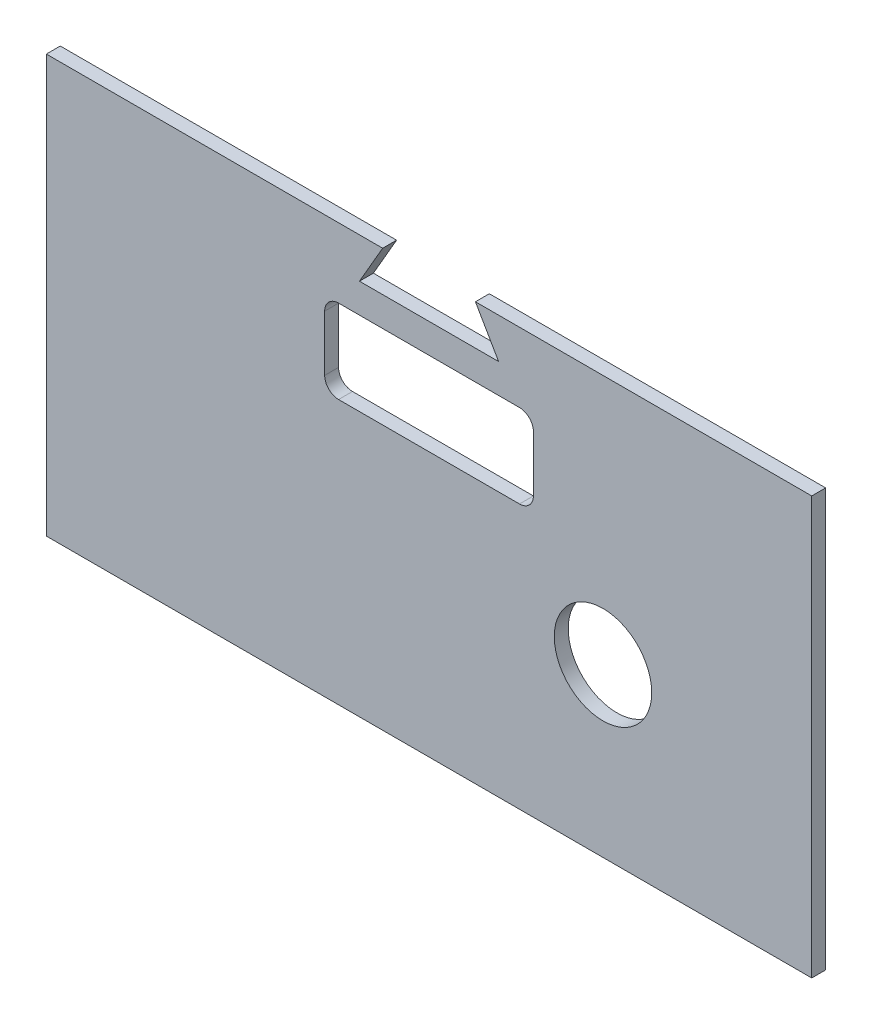
ISO-10303-21;
HEADER;
FILE_DESCRIPTION(('STEP AP214'),'2;1');
FILE_NAME('part.step','',(''),(''),'','','');
FILE_SCHEMA(('AUTOMOTIVE_DESIGN { 1 0 10303 214 1 1 1 1 }'));
ENDSEC;
DATA;
#1=APPLICATION_CONTEXT('core data for automotive mechanical design processes');
#2=APPLICATION_PROTOCOL_DEFINITION('international standard','automotive_design',2000,#1);
#3=PRODUCT_CONTEXT('',#1,'mechanical');
#4=PRODUCT('Part','Part','',(#3));
#5=PRODUCT_RELATED_PRODUCT_CATEGORY('part','',(#4));
#6=PRODUCT_DEFINITION_FORMATION('','',#4);
#7=PRODUCT_DEFINITION_CONTEXT('part definition',#1,'design');
#8=PRODUCT_DEFINITION('design','',#6,#7);
#9=PRODUCT_DEFINITION_SHAPE('','',#8);
#10=(LENGTH_UNIT() NAMED_UNIT(*) SI_UNIT(.MILLI.,.METRE.));
#11=(NAMED_UNIT(*) PLANE_ANGLE_UNIT() SI_UNIT($,.RADIAN.));
#12=(NAMED_UNIT(*) SI_UNIT($,.STERADIAN.) SOLID_ANGLE_UNIT());
#13=UNCERTAINTY_MEASURE_WITH_UNIT(LENGTH_MEASURE(1.E-05),#10,'distance_accuracy_value','');
#14=(GEOMETRIC_REPRESENTATION_CONTEXT(3) GLOBAL_UNCERTAINTY_ASSIGNED_CONTEXT((#13)) GLOBAL_UNIT_ASSIGNED_CONTEXT((#10,
#11,#12)) REPRESENTATION_CONTEXT('',''));
#15=CARTESIAN_POINT('',(0.,0.,0.));
#16=DIRECTION('',(0.,0.,1.));
#17=DIRECTION('',(1.,0.,0.));
#18=AXIS2_PLACEMENT_3D('',#15,#16,#17);
#19=CARTESIAN_POINT('',(-27.5,15.,1.));
#20=DIRECTION('',(0.,-1.,0.));
#21=DIRECTION('',(0.,0.,-1.));
#22=AXIS2_PLACEMENT_3D('',#19,#20,#21);
#23=PLANE('',#22);
#24=DIRECTION('',(-1.,0.,0.));
#25=VECTOR('',#24,1.);
#26=CARTESIAN_POINT('',(-27.5,15.,0.));
#27=LINE('',#26,#25);
#28=CARTESIAN_POINT('',(27.5,15.,0.));
#29=VERTEX_POINT('',#28);
#30=CARTESIAN_POINT('',(3.33333333333333,15.,0.));
#31=VERTEX_POINT('',#30);
#32=EDGE_CURVE('E228',#29,#31,#27,.T.);
#33=ORIENTED_EDGE('',*,*,#32,.T.);
#34=DIRECTION('',(0.,0.,1.));
#35=VECTOR('',#34,1.);
#36=CARTESIAN_POINT('',(3.33333333333333,15.,1.));
#37=LINE('',#36,#35);
#38=CARTESIAN_POINT('',(3.33333333333333,15.,1.));
#39=VERTEX_POINT('',#38);
#40=EDGE_CURVE('E163',#31,#39,#37,.T.);
#41=ORIENTED_EDGE('',*,*,#40,.T.);
#42=DIRECTION('',(-1.,0.,0.));
#43=VECTOR('',#42,1.);
#44=CARTESIAN_POINT('',(-27.5,15.,1.));
#45=LINE('',#44,#43);
#46=CARTESIAN_POINT('',(27.5,15.,1.));
#47=VERTEX_POINT('',#46);
#48=EDGE_CURVE('E217',#47,#39,#45,.T.);
#49=ORIENTED_EDGE('',*,*,#48,.F.);
#50=DIRECTION('',(0.,0.,-1.));
#51=VECTOR('',#50,1.);
#52=CARTESIAN_POINT('',(27.5,15.,1.));
#53=LINE('',#52,#51);
#54=EDGE_CURVE('E241',#47,#29,#53,.T.);
#55=ORIENTED_EDGE('',*,*,#54,.T.);
#56=EDGE_LOOP('',(#33,#41,#49,#55));
#57=FACE_BOUND('',#56,.T.);
#58=ADVANCED_FACE('F33',(#57),#23,.F.);
#59=CARTESIAN_POINT('',(27.5,-15.,1.));
#60=DIRECTION('',(-1.,0.,0.));
#61=DIRECTION('',(0.,0.,1.));
#62=AXIS2_PLACEMENT_3D('',#59,#60,#61);
#63=PLANE('',#62);
#64=DIRECTION('',(0.,1.,0.));
#65=VECTOR('',#64,1.);
#66=CARTESIAN_POINT('',(27.5,-15.,0.));
#67=LINE('',#66,#65);
#68=CARTESIAN_POINT('',(27.5,-15.,0.));
#69=VERTEX_POINT('',#68);
#70=EDGE_CURVE('E211',#69,#29,#67,.T.);
#71=ORIENTED_EDGE('',*,*,#70,.T.);
#72=ORIENTED_EDGE('',*,*,#54,.F.);
#73=DIRECTION('',(0.,1.,0.));
#74=VECTOR('',#73,1.);
#75=CARTESIAN_POINT('',(27.5,-15.,1.));
#76=LINE('',#75,#74);
#77=CARTESIAN_POINT('',(27.5,-15.,1.));
#78=VERTEX_POINT('',#77);
#79=EDGE_CURVE('E212',#78,#47,#76,.T.);
#80=ORIENTED_EDGE('',*,*,#79,.F.);
#81=DIRECTION('',(0.,0.,-1.));
#82=VECTOR('',#81,1.);
#83=CARTESIAN_POINT('',(27.5,-15.,1.));
#84=LINE('',#83,#82);
#85=EDGE_CURVE('E224',#78,#69,#84,.T.);
#86=ORIENTED_EDGE('',*,*,#85,.T.);
#87=EDGE_LOOP('',(#71,#72,#80,#86));
#88=FACE_BOUND('',#87,.T.);
#89=ADVANCED_FACE('F294',(#88),#63,.F.);
#90=CARTESIAN_POINT('',(-3.33333333333334,15.,1.));
#91=VERTEX_POINT('',#90);
#92=CARTESIAN_POINT('',(-27.5,15.,1.));
#93=VERTEX_POINT('',#92);
#94=EDGE_CURVE('E215',#91,#93,#45,.T.);
#95=ORIENTED_EDGE('',*,*,#94,.F.);
#96=DIRECTION('',(0.,0.,-1.));
#97=VECTOR('',#96,1.);
#98=CARTESIAN_POINT('',(-3.33333333333334,15.,1.));
#99=LINE('',#98,#97);
#100=CARTESIAN_POINT('',(-3.33333333333334,15.,0.));
#101=VERTEX_POINT('',#100);
#102=EDGE_CURVE('E204',#91,#101,#99,.T.);
#103=ORIENTED_EDGE('',*,*,#102,.T.);
#104=CARTESIAN_POINT('',(-27.5,15.,0.));
#105=VERTEX_POINT('',#104);
#106=EDGE_CURVE('E227',#101,#105,#27,.T.);
#107=ORIENTED_EDGE('',*,*,#106,.T.);
#108=DIRECTION('',(0.,0.,-1.));
#109=VECTOR('',#108,1.);
#110=CARTESIAN_POINT('',(-27.5,15.,1.));
#111=LINE('',#110,#109);
#112=EDGE_CURVE('E238',#93,#105,#111,.T.);
#113=ORIENTED_EDGE('',*,*,#112,.F.);
#114=EDGE_LOOP('',(#95,#103,#107,#113));
#115=FACE_BOUND('',#114,.T.);
#116=ADVANCED_FACE('F297',(#115),#23,.F.);
#117=CARTESIAN_POINT('',(-27.5,-15.,1.));
#118=DIRECTION('',(1.,0.,0.));
#119=DIRECTION('',(0.,0.,-1.));
#120=AXIS2_PLACEMENT_3D('',#117,#118,#119);
#121=PLANE('',#120);
#122=DIRECTION('',(0.,-1.,0.));
#123=VECTOR('',#122,1.);
#124=CARTESIAN_POINT('',(-27.5,-15.,0.));
#125=LINE('',#124,#123);
#126=CARTESIAN_POINT('',(-27.5,-15.,0.));
#127=VERTEX_POINT('',#126);
#128=EDGE_CURVE('E230',#105,#127,#125,.T.);
#129=ORIENTED_EDGE('',*,*,#128,.T.);
#130=DIRECTION('',(0.,0.,-1.));
#131=VECTOR('',#130,1.);
#132=CARTESIAN_POINT('',(-27.5,-15.,1.));
#133=LINE('',#132,#131);
#134=CARTESIAN_POINT('',(-27.5,-15.,1.));
#135=VERTEX_POINT('',#134);
#136=EDGE_CURVE('E235',#135,#127,#133,.T.);
#137=ORIENTED_EDGE('',*,*,#136,.F.);
#138=DIRECTION('',(0.,-1.,0.));
#139=VECTOR('',#138,1.);
#140=CARTESIAN_POINT('',(-27.5,-15.,1.));
#141=LINE('',#140,#139);
#142=EDGE_CURVE('E220',#93,#135,#141,.T.);
#143=ORIENTED_EDGE('',*,*,#142,.F.);
#144=ORIENTED_EDGE('',*,*,#112,.T.);
#145=EDGE_LOOP('',(#129,#137,#143,#144));
#146=FACE_BOUND('',#145,.T.);
#147=ADVANCED_FACE('F305',(#146),#121,.F.);
#148=CARTESIAN_POINT('',(-27.5,-15.,1.));
#149=DIRECTION('',(0.,1.,0.));
#150=DIRECTION('',(0.,0.,1.));
#151=AXIS2_PLACEMENT_3D('',#148,#149,#150);
#152=PLANE('',#151);
#153=DIRECTION('',(1.,0.,0.));
#154=VECTOR('',#153,1.);
#155=CARTESIAN_POINT('',(-27.5,-15.,0.));
#156=LINE('',#155,#154);
#157=EDGE_CURVE('E216',#127,#69,#156,.T.);
#158=ORIENTED_EDGE('',*,*,#157,.T.);
#159=ORIENTED_EDGE('',*,*,#85,.F.);
#160=DIRECTION('',(1.,0.,0.));
#161=VECTOR('',#160,1.);
#162=CARTESIAN_POINT('',(-27.5,-15.,1.));
#163=LINE('',#162,#161);
#164=EDGE_CURVE('E222',#135,#78,#163,.T.);
#165=ORIENTED_EDGE('',*,*,#164,.F.);
#166=ORIENTED_EDGE('',*,*,#136,.T.);
#167=EDGE_LOOP('',(#158,#159,#165,#166));
#168=FACE_BOUND('',#167,.T.);
#169=ADVANCED_FACE('F310',(#168),#152,.F.);
#170=CARTESIAN_POINT('',(0.,0.,1.));
#171=DIRECTION('',(0.,0.,-1.));
#172=DIRECTION('',(-1.,0.,0.));
#173=AXIS2_PLACEMENT_3D('',#170,#171,#172);
#174=PLANE('',#173);
#175=CARTESIAN_POINT('',(12.5,-3.,1.));
#176=DIRECTION('',(0.,0.,-1.));
#177=DIRECTION('',(-1.,0.,0.));
#178=AXIS2_PLACEMENT_3D('',#175,#176,#177);
#179=CIRCLE('',#178,3.5);
#180=CARTESIAN_POINT('',(8.99999999999999,-3.,1.));
#181=VERTEX_POINT('',#180);
#182=EDGE_CURVE('E198',#181,#181,#179,.T.);
#183=ORIENTED_EDGE('',*,*,#182,.T.);
#184=EDGE_LOOP('',(#183));
#185=FACE_BOUND('',#184,.T.);
#186=DIRECTION('',(0.,-1.,0.));
#187=VECTOR('',#186,1.);
#188=CARTESIAN_POINT('',(7.49999999999999,0.,1.));
#189=LINE('',#188,#187);
#190=CARTESIAN_POINT('',(7.49999999999999,9.00000000000001,1.));
#191=VERTEX_POINT('',#190);
#192=CARTESIAN_POINT('',(7.49999999999999,5.,1.));
#193=VERTEX_POINT('',#192);
#194=EDGE_CURVE('E191',#191,#193,#189,.T.);
#195=ORIENTED_EDGE('',*,*,#194,.T.);
#196=CARTESIAN_POINT('',(6.49999999999999,5.,1.));
#197=DIRECTION('',(0.,0.,-1.));
#198=DIRECTION('',(-1.,0.,0.));
#199=AXIS2_PLACEMENT_3D('',#196,#197,#198);
#200=CIRCLE('',#199,1.);
#201=CARTESIAN_POINT('',(6.49999999999999,4.,1.));
#202=VERTEX_POINT('',#201);
#203=EDGE_CURVE('E268',#193,#202,#200,.T.);
#204=ORIENTED_EDGE('',*,*,#203,.T.);
#205=DIRECTION('',(-1.,0.,0.));
#206=VECTOR('',#205,1.);
#207=CARTESIAN_POINT('',(0.,4.,1.));
#208=LINE('',#207,#206);
#209=CARTESIAN_POINT('',(-6.50000000000001,4.,1.));
#210=VERTEX_POINT('',#209);
#211=EDGE_CURVE('E188',#202,#210,#208,.T.);
#212=ORIENTED_EDGE('',*,*,#211,.T.);
#213=CARTESIAN_POINT('',(-6.50000000000001,5.,1.));
#214=DIRECTION('',(0.,0.,-1.));
#215=DIRECTION('',(-1.,0.,0.));
#216=AXIS2_PLACEMENT_3D('',#213,#214,#215);
#217=CIRCLE('',#216,1.);
#218=CARTESIAN_POINT('',(-7.50000000000001,5.,1.));
#219=VERTEX_POINT('',#218);
#220=EDGE_CURVE('E264',#210,#219,#217,.T.);
#221=ORIENTED_EDGE('',*,*,#220,.T.);
#222=DIRECTION('',(0.,1.,0.));
#223=VECTOR('',#222,1.);
#224=CARTESIAN_POINT('',(-7.50000000000001,0.,1.));
#225=LINE('',#224,#223);
#226=CARTESIAN_POINT('',(-7.50000000000001,9.00000000000001,1.));
#227=VERTEX_POINT('',#226);
#228=EDGE_CURVE('E196',#219,#227,#225,.T.);
#229=ORIENTED_EDGE('',*,*,#228,.T.);
#230=CARTESIAN_POINT('',(-6.50000000000001,9.00000000000001,1.));
#231=DIRECTION('',(0.,0.,-1.));
#232=DIRECTION('',(-1.,0.,0.));
#233=AXIS2_PLACEMENT_3D('',#230,#231,#232);
#234=CIRCLE('',#233,1.);
#235=CARTESIAN_POINT('',(-6.50000000000001,10.,1.));
#236=VERTEX_POINT('',#235);
#237=EDGE_CURVE('E41',#227,#236,#234,.T.);
#238=ORIENTED_EDGE('',*,*,#237,.T.);
#239=DIRECTION('',(1.,0.,0.));
#240=VECTOR('',#239,1.);
#241=CARTESIAN_POINT('',(0.,10.,1.));
#242=LINE('',#241,#240);
#243=CARTESIAN_POINT('',(6.49999999999998,10.,1.));
#244=VERTEX_POINT('',#243);
#245=EDGE_CURVE('E194',#236,#244,#242,.T.);
#246=ORIENTED_EDGE('',*,*,#245,.T.);
#247=CARTESIAN_POINT('',(6.49999999999998,9.00000000000001,1.));
#248=DIRECTION('',(0.,0.,-1.));
#249=DIRECTION('',(-1.,0.,0.));
#250=AXIS2_PLACEMENT_3D('',#247,#248,#249);
#251=CIRCLE('',#250,1.);
#252=EDGE_CURVE('E48',#244,#191,#251,.T.);
#253=ORIENTED_EDGE('',*,*,#252,.T.);
#254=EDGE_LOOP('',(#195,#204,#212,#221,#229,#238,#246,#253));
#255=FACE_BOUND('',#254,.T.);
#256=ORIENTED_EDGE('',*,*,#48,.T.);
#257=DIRECTION('',(0.5,-0.866025403784439,0.));
#258=VECTOR('',#257,1.);
#259=CARTESIAN_POINT('',(8.99519052838328,5.19337567297406,1.));
#260=LINE('',#259,#258);
#261=CARTESIAN_POINT('',(4.99999999999999,12.1132486540519,1.));
#262=VERTEX_POINT('',#261);
#263=EDGE_CURVE('E208',#39,#262,#260,.T.);
#264=ORIENTED_EDGE('',*,*,#263,.T.);
#265=DIRECTION('',(-1.,0.,0.));
#266=VECTOR('',#265,1.);
#267=CARTESIAN_POINT('',(0.,12.1132486540519,1.));
#268=LINE('',#267,#266);
#269=CARTESIAN_POINT('',(-5.,12.1132486540519,1.));
#270=VERTEX_POINT('',#269);
#271=EDGE_CURVE('E153',#262,#270,#268,.T.);
#272=ORIENTED_EDGE('',*,*,#271,.T.);
#273=DIRECTION('',(0.5,0.866025403784439,0.));
#274=VECTOR('',#273,1.);
#275=CARTESIAN_POINT('',(-8.9951905283833,5.19337567297407,1.));
#276=LINE('',#275,#274);
#277=EDGE_CURVE('E201',#270,#91,#276,.T.);
#278=ORIENTED_EDGE('',*,*,#277,.T.);
#279=ORIENTED_EDGE('',*,*,#94,.T.);
#280=ORIENTED_EDGE('',*,*,#142,.T.);
#281=ORIENTED_EDGE('',*,*,#164,.T.);
#282=ORIENTED_EDGE('',*,*,#79,.T.);
#283=EDGE_LOOP('',(#256,#264,#272,#278,#279,#280,#281,#282));
#284=FACE_BOUND('',#283,.T.);
#285=ADVANCED_FACE('F316',(#185,#255,#284),#174,.F.);
#286=CARTESIAN_POINT('',(0.,0.,0.));
#287=DIRECTION('',(0.,0.,-1.));
#288=DIRECTION('',(-1.,0.,0.));
#289=AXIS2_PLACEMENT_3D('',#286,#287,#288);
#290=PLANE('',#289);
#291=DIRECTION('',(-0.5,0.866025403784439,0.));
#292=VECTOR('',#291,1.);
#293=CARTESIAN_POINT('',(4.99999999999999,12.1132486540519,0.));
#294=LINE('',#293,#292);
#295=CARTESIAN_POINT('',(4.99999999999999,12.1132486540519,0.));
#296=VERTEX_POINT('',#295);
#297=EDGE_CURVE('E160',#296,#31,#294,.T.);
#298=ORIENTED_EDGE('',*,*,#297,.T.);
#299=ORIENTED_EDGE('',*,*,#32,.F.);
#300=ORIENTED_EDGE('',*,*,#70,.F.);
#301=ORIENTED_EDGE('',*,*,#157,.F.);
#302=ORIENTED_EDGE('',*,*,#128,.F.);
#303=ORIENTED_EDGE('',*,*,#106,.F.);
#304=DIRECTION('',(0.5,0.866025403784439,0.));
#305=VECTOR('',#304,1.);
#306=CARTESIAN_POINT('',(-8.9951905283833,5.19337567297407,0.));
#307=LINE('',#306,#305);
#308=CARTESIAN_POINT('',(-5.,12.1132486540519,0.));
#309=VERTEX_POINT('',#308);
#310=EDGE_CURVE('E171',#309,#101,#307,.T.);
#311=ORIENTED_EDGE('',*,*,#310,.F.);
#312=DIRECTION('',(1.,0.,0.));
#313=VECTOR('',#312,1.);
#314=CARTESIAN_POINT('',(-5.,12.1132486540519,0.));
#315=LINE('',#314,#313);
#316=EDGE_CURVE('E150',#309,#296,#315,.T.);
#317=ORIENTED_EDGE('',*,*,#316,.T.);
#318=EDGE_LOOP('',(#298,#299,#300,#301,#302,#303,#311,#317));
#319=FACE_BOUND('',#318,.T.);
#320=CARTESIAN_POINT('',(12.5,-3.,0.));
#321=DIRECTION('',(0.,0.,1.));
#322=DIRECTION('',(1.,0.,0.));
#323=AXIS2_PLACEMENT_3D('',#320,#321,#322);
#324=CIRCLE('',#323,3.5);
#325=CARTESIAN_POINT('',(16.,-3.,0.));
#326=VERTEX_POINT('',#325);
#327=EDGE_CURVE('E156',#326,#326,#324,.T.);
#328=ORIENTED_EDGE('',*,*,#327,.T.);
#329=EDGE_LOOP('',(#328));
#330=FACE_BOUND('',#329,.T.);
#331=DIRECTION('',(-1.,0.,0.));
#332=VECTOR('',#331,1.);
#333=CARTESIAN_POINT('',(-7.50000000000001,10.,0.));
#334=LINE('',#333,#332);
#335=CARTESIAN_POINT('',(6.49999999999998,10.,0.));
#336=VERTEX_POINT('',#335);
#337=CARTESIAN_POINT('',(-6.50000000000001,10.,0.));
#338=VERTEX_POINT('',#337);
#339=EDGE_CURVE('E185',#336,#338,#334,.T.);
#340=ORIENTED_EDGE('',*,*,#339,.T.);
#341=CARTESIAN_POINT('',(-6.50000000000001,9.00000000000001,0.));
#342=DIRECTION('',(0.,0.,-1.));
#343=DIRECTION('',(-1.,0.,0.));
#344=AXIS2_PLACEMENT_3D('',#341,#342,#343);
#345=CIRCLE('',#344,1.);
#346=CARTESIAN_POINT('',(-7.50000000000001,9.00000000000001,0.));
#347=VERTEX_POINT('',#346);
#348=EDGE_CURVE('E11',#338,#347,#345,.F.);
#349=ORIENTED_EDGE('',*,*,#348,.T.);
#350=DIRECTION('',(0.,-1.,0.));
#351=VECTOR('',#350,1.);
#352=CARTESIAN_POINT('',(-7.50000000000001,10.,0.));
#353=LINE('',#352,#351);
#354=CARTESIAN_POINT('',(-7.50000000000001,5.,0.));
#355=VERTEX_POINT('',#354);
#356=EDGE_CURVE('E176',#347,#355,#353,.T.);
#357=ORIENTED_EDGE('',*,*,#356,.T.);
#358=CARTESIAN_POINT('',(-6.50000000000001,5.,0.));
#359=DIRECTION('',(0.,0.,-1.));
#360=DIRECTION('',(-1.,0.,0.));
#361=AXIS2_PLACEMENT_3D('',#358,#359,#360);
#362=CIRCLE('',#361,1.);
#363=CARTESIAN_POINT('',(-6.50000000000001,4.,0.));
#364=VERTEX_POINT('',#363);
#365=EDGE_CURVE('E266',#355,#364,#362,.F.);
#366=ORIENTED_EDGE('',*,*,#365,.T.);
#367=DIRECTION('',(1.,0.,0.));
#368=VECTOR('',#367,1.);
#369=CARTESIAN_POINT('',(-7.50000000000001,4.,0.));
#370=LINE('',#369,#368);
#371=CARTESIAN_POINT('',(6.49999999999999,4.,0.));
#372=VERTEX_POINT('',#371);
#373=EDGE_CURVE('E179',#364,#372,#370,.T.);
#374=ORIENTED_EDGE('',*,*,#373,.T.);
#375=CARTESIAN_POINT('',(6.49999999999999,5.,0.));
#376=DIRECTION('',(0.,0.,-1.));
#377=DIRECTION('',(-1.,0.,0.));
#378=AXIS2_PLACEMENT_3D('',#375,#376,#377);
#379=CIRCLE('',#378,1.);
#380=CARTESIAN_POINT('',(7.49999999999999,5.,0.));
#381=VERTEX_POINT('',#380);
#382=EDGE_CURVE('E270',#372,#381,#379,.F.);
#383=ORIENTED_EDGE('',*,*,#382,.T.);
#384=DIRECTION('',(0.,1.,0.));
#385=VECTOR('',#384,1.);
#386=CARTESIAN_POINT('',(7.49999999999999,10.,0.));
#387=LINE('',#386,#385);
#388=CARTESIAN_POINT('',(7.49999999999999,9.00000000000001,0.));
#389=VERTEX_POINT('',#388);
#390=EDGE_CURVE('E182',#381,#389,#387,.T.);
#391=ORIENTED_EDGE('',*,*,#390,.T.);
#392=CARTESIAN_POINT('',(6.49999999999998,9.00000000000001,0.));
#393=DIRECTION('',(0.,0.,-1.));
#394=DIRECTION('',(-1.,0.,0.));
#395=AXIS2_PLACEMENT_3D('',#392,#393,#394);
#396=CIRCLE('',#395,1.);
#397=EDGE_CURVE('E273',#389,#336,#396,.F.);
#398=ORIENTED_EDGE('',*,*,#397,.T.);
#399=EDGE_LOOP('',(#340,#349,#357,#366,#374,#383,#391,#398));
#400=FACE_BOUND('',#399,.T.);
#401=ADVANCED_FACE('F168',(#319,#330,#400),#290,.T.);
#402=CARTESIAN_POINT('',(-7.50000000000001,10.,0.));
#403=DIRECTION('',(-1.,0.,0.));
#404=DIRECTION('',(0.,-1.,0.));
#405=AXIS2_PLACEMENT_3D('',#402,#403,#404);
#406=PLANE('',#405);
#407=ORIENTED_EDGE('',*,*,#228,.F.);
#408=DIRECTION('',(0.,0.,1.));
#409=VECTOR('',#408,1.);
#410=CARTESIAN_POINT('',(-7.50000000000001,5.,0.));
#411=LINE('',#410,#409);
#412=EDGE_CURVE('E253',#219,#355,#411,.F.);
#413=ORIENTED_EDGE('',*,*,#412,.T.);
#414=ORIENTED_EDGE('',*,*,#356,.F.);
#415=DIRECTION('',(0.,0.,1.));
#416=VECTOR('',#415,1.);
#417=CARTESIAN_POINT('',(-7.50000000000001,9.00000000000001,1.));
#418=LINE('',#417,#416);
#419=EDGE_CURVE('E250',#347,#227,#418,.T.);
#420=ORIENTED_EDGE('',*,*,#419,.T.);
#421=EDGE_LOOP('',(#407,#413,#414,#420));
#422=FACE_BOUND('',#421,.T.);
#423=ADVANCED_FACE('F337',(#422),#406,.F.);
#424=CARTESIAN_POINT('',(-7.50000000000001,10.,0.));
#425=DIRECTION('',(0.,1.,0.));
#426=DIRECTION('',(0.,0.,1.));
#427=AXIS2_PLACEMENT_3D('',#424,#425,#426);
#428=PLANE('',#427);
#429=ORIENTED_EDGE('',*,*,#339,.F.);
#430=DIRECTION('',(0.,0.,1.));
#431=VECTOR('',#430,1.);
#432=CARTESIAN_POINT('',(6.49999999999998,10.,1.));
#433=LINE('',#432,#431);
#434=EDGE_CURVE('E262',#336,#244,#433,.T.);
#435=ORIENTED_EDGE('',*,*,#434,.T.);
#436=ORIENTED_EDGE('',*,*,#245,.F.);
#437=DIRECTION('',(0.,0.,1.));
#438=VECTOR('',#437,1.);
#439=CARTESIAN_POINT('',(-6.50000000000001,10.,0.));
#440=LINE('',#439,#438);
#441=EDGE_CURVE('E260',#236,#338,#440,.F.);
#442=ORIENTED_EDGE('',*,*,#441,.T.);
#443=EDGE_LOOP('',(#429,#435,#436,#442));
#444=FACE_BOUND('',#443,.T.);
#445=ADVANCED_FACE('F280',(#444),#428,.F.);
#446=CARTESIAN_POINT('',(7.49999999999999,10.,0.));
#447=DIRECTION('',(1.,0.,0.));
#448=DIRECTION('',(0.,0.,-1.));
#449=AXIS2_PLACEMENT_3D('',#446,#447,#448);
#450=PLANE('',#449);
#451=ORIENTED_EDGE('',*,*,#390,.F.);
#452=DIRECTION('',(0.,0.,1.));
#453=VECTOR('',#452,1.);
#454=CARTESIAN_POINT('',(7.49999999999999,5.,1.));
#455=LINE('',#454,#453);
#456=EDGE_CURVE('E257',#381,#193,#455,.T.);
#457=ORIENTED_EDGE('',*,*,#456,.T.);
#458=ORIENTED_EDGE('',*,*,#194,.F.);
#459=DIRECTION('',(0.,0.,1.));
#460=VECTOR('',#459,1.);
#461=CARTESIAN_POINT('',(7.49999999999999,9.00000000000001,0.));
#462=LINE('',#461,#460);
#463=EDGE_CURVE('E255',#191,#389,#462,.F.);
#464=ORIENTED_EDGE('',*,*,#463,.T.);
#465=EDGE_LOOP('',(#451,#457,#458,#464));
#466=FACE_BOUND('',#465,.T.);
#467=ADVANCED_FACE('F336',(#466),#450,.F.);
#468=CARTESIAN_POINT('',(-7.50000000000001,4.,0.));
#469=DIRECTION('',(0.,-1.,0.));
#470=DIRECTION('',(0.,0.,-1.));
#471=AXIS2_PLACEMENT_3D('',#468,#469,#470);
#472=PLANE('',#471);
#473=ORIENTED_EDGE('',*,*,#373,.F.);
#474=DIRECTION('',(0.,0.,1.));
#475=VECTOR('',#474,1.);
#476=CARTESIAN_POINT('',(-6.50000000000001,4.,1.));
#477=LINE('',#476,#475);
#478=EDGE_CURVE('E247',#364,#210,#477,.T.);
#479=ORIENTED_EDGE('',*,*,#478,.T.);
#480=ORIENTED_EDGE('',*,*,#211,.F.);
#481=DIRECTION('',(0.,0.,1.));
#482=VECTOR('',#481,1.);
#483=CARTESIAN_POINT('',(6.49999999999999,4.,0.));
#484=LINE('',#483,#482);
#485=EDGE_CURVE('E245',#202,#372,#484,.F.);
#486=ORIENTED_EDGE('',*,*,#485,.T.);
#487=EDGE_LOOP('',(#473,#479,#480,#486));
#488=FACE_BOUND('',#487,.T.);
#489=ADVANCED_FACE('F340',(#488),#472,.F.);
#490=CARTESIAN_POINT('',(12.5,-3.,0.));
#491=DIRECTION('',(0.,0.,1.));
#492=DIRECTION('',(1.,0.,0.));
#493=AXIS2_PLACEMENT_3D('',#490,#491,#492);
#494=CYLINDRICAL_SURFACE('',#493,3.5);
#495=ORIENTED_EDGE('',*,*,#327,.F.);
#496=EDGE_LOOP('',(#495));
#497=FACE_BOUND('',#496,.T.);
#498=ORIENTED_EDGE('',*,*,#182,.F.);
#499=EDGE_LOOP('',(#498));
#500=FACE_BOUND('',#499,.T.);
#501=ADVANCED_FACE('F333',(#497,#500),#494,.F.);
#502=CARTESIAN_POINT('',(4.99999999999999,12.1132486540519,0.));
#503=DIRECTION('',(0.866025403784439,0.5,0.));
#504=DIRECTION('',(-0.5,0.866025403784439,0.));
#505=AXIS2_PLACEMENT_3D('',#502,#503,#504);
#506=PLANE('',#505);
#507=ORIENTED_EDGE('',*,*,#297,.F.);
#508=DIRECTION('',(0.,0.,1.));
#509=VECTOR('',#508,1.);
#510=CARTESIAN_POINT('',(4.99999999999999,12.1132486540519,0.));
#511=LINE('',#510,#509);
#512=EDGE_CURVE('E145',#296,#262,#511,.T.);
#513=ORIENTED_EDGE('',*,*,#512,.T.);
#514=ORIENTED_EDGE('',*,*,#263,.F.);
#515=ORIENTED_EDGE('',*,*,#40,.F.);
#516=EDGE_LOOP('',(#507,#513,#514,#515));
#517=FACE_BOUND('',#516,.T.);
#518=ADVANCED_FACE('F161',(#517),#506,.F.);
#519=CARTESIAN_POINT('',(-5.,12.1132486540519,0.));
#520=DIRECTION('',(0.,-1.,0.));
#521=DIRECTION('',(1.,0.,0.));
#522=AXIS2_PLACEMENT_3D('',#519,#520,#521);
#523=PLANE('',#522);
#524=ORIENTED_EDGE('',*,*,#512,.F.);
#525=ORIENTED_EDGE('',*,*,#316,.F.);
#526=DIRECTION('',(0.,0.,1.));
#527=VECTOR('',#526,1.);
#528=CARTESIAN_POINT('',(-5.,12.1132486540519,0.));
#529=LINE('',#528,#527);
#530=EDGE_CURVE('E157',#309,#270,#529,.T.);
#531=ORIENTED_EDGE('',*,*,#530,.T.);
#532=ORIENTED_EDGE('',*,*,#271,.F.);
#533=EDGE_LOOP('',(#524,#525,#531,#532));
#534=FACE_BOUND('',#533,.T.);
#535=ADVANCED_FACE('F147',(#534),#523,.F.);
#536=CARTESIAN_POINT('',(0.,20.7735026918963,0.));
#537=DIRECTION('',(-0.866025403784439,0.5,0.));
#538=DIRECTION('',(-0.5,-0.866025403784439,0.));
#539=AXIS2_PLACEMENT_3D('',#536,#537,#538);
#540=PLANE('',#539);
#541=ORIENTED_EDGE('',*,*,#277,.F.);
#542=ORIENTED_EDGE('',*,*,#530,.F.);
#543=ORIENTED_EDGE('',*,*,#310,.T.);
#544=ORIENTED_EDGE('',*,*,#102,.F.);
#545=EDGE_LOOP('',(#541,#542,#543,#544));
#546=FACE_BOUND('',#545,.T.);
#547=ADVANCED_FACE('F319',(#546),#540,.F.);
#548=CARTESIAN_POINT('',(-6.50000000000001,5.,0.));
#549=DIRECTION('',(0.,0.,-1.));
#550=DIRECTION('',(-1.,0.,0.));
#551=AXIS2_PLACEMENT_3D('',#548,#549,#550);
#552=CYLINDRICAL_SURFACE('',#551,1.);
#553=ORIENTED_EDGE('',*,*,#365,.F.);
#554=ORIENTED_EDGE('',*,*,#412,.F.);
#555=ORIENTED_EDGE('',*,*,#220,.F.);
#556=ORIENTED_EDGE('',*,*,#478,.F.);
#557=EDGE_LOOP('',(#553,#554,#555,#556));
#558=FACE_BOUND('',#557,.T.);
#559=ADVANCED_FACE('F290',(#558),#552,.F.);
#560=CARTESIAN_POINT('',(6.49999999999999,5.,0.));
#561=DIRECTION('',(0.,0.,-1.));
#562=DIRECTION('',(-1.,0.,0.));
#563=AXIS2_PLACEMENT_3D('',#560,#561,#562);
#564=CYLINDRICAL_SURFACE('',#563,1.);
#565=ORIENTED_EDGE('',*,*,#382,.F.);
#566=ORIENTED_EDGE('',*,*,#485,.F.);
#567=ORIENTED_EDGE('',*,*,#203,.F.);
#568=ORIENTED_EDGE('',*,*,#456,.F.);
#569=EDGE_LOOP('',(#565,#566,#567,#568));
#570=FACE_BOUND('',#569,.T.);
#571=ADVANCED_FACE('F284',(#570),#564,.F.);
#572=CARTESIAN_POINT('',(6.49999999999998,9.00000000000001,0.));
#573=DIRECTION('',(0.,0.,-1.));
#574=DIRECTION('',(-1.,0.,0.));
#575=AXIS2_PLACEMENT_3D('',#572,#573,#574);
#576=CYLINDRICAL_SURFACE('',#575,1.);
#577=ORIENTED_EDGE('',*,*,#397,.F.);
#578=ORIENTED_EDGE('',*,*,#463,.F.);
#579=ORIENTED_EDGE('',*,*,#252,.F.);
#580=ORIENTED_EDGE('',*,*,#434,.F.);
#581=EDGE_LOOP('',(#577,#578,#579,#580));
#582=FACE_BOUND('',#581,.T.);
#583=ADVANCED_FACE('F282',(#582),#576,.F.);
#584=CARTESIAN_POINT('',(-6.50000000000001,9.00000000000001,0.));
#585=DIRECTION('',(0.,0.,-1.));
#586=DIRECTION('',(-1.,0.,0.));
#587=AXIS2_PLACEMENT_3D('',#584,#585,#586);
#588=CYLINDRICAL_SURFACE('',#587,1.);
#589=ORIENTED_EDGE('',*,*,#348,.F.);
#590=ORIENTED_EDGE('',*,*,#441,.F.);
#591=ORIENTED_EDGE('',*,*,#237,.F.);
#592=ORIENTED_EDGE('',*,*,#419,.F.);
#593=EDGE_LOOP('',(#589,#590,#591,#592));
#594=FACE_BOUND('',#593,.T.);
#595=ADVANCED_FACE('F35',(#594),#588,.F.);
#596=CLOSED_SHELL('',(#58,#89,#116,#147,#169,#285,#401,#423,#445,#467,#489,#501,#518,#535,#547,
#559,#571,#583,#595));
#597=MANIFOLD_SOLID_BREP('B2',#596);
#598=ADVANCED_BREP_SHAPE_REPRESENTATION('',(#18,#597),#14);
#599=SHAPE_DEFINITION_REPRESENTATION(#9,#598);
ENDSEC;
END-ISO-10303-21;
